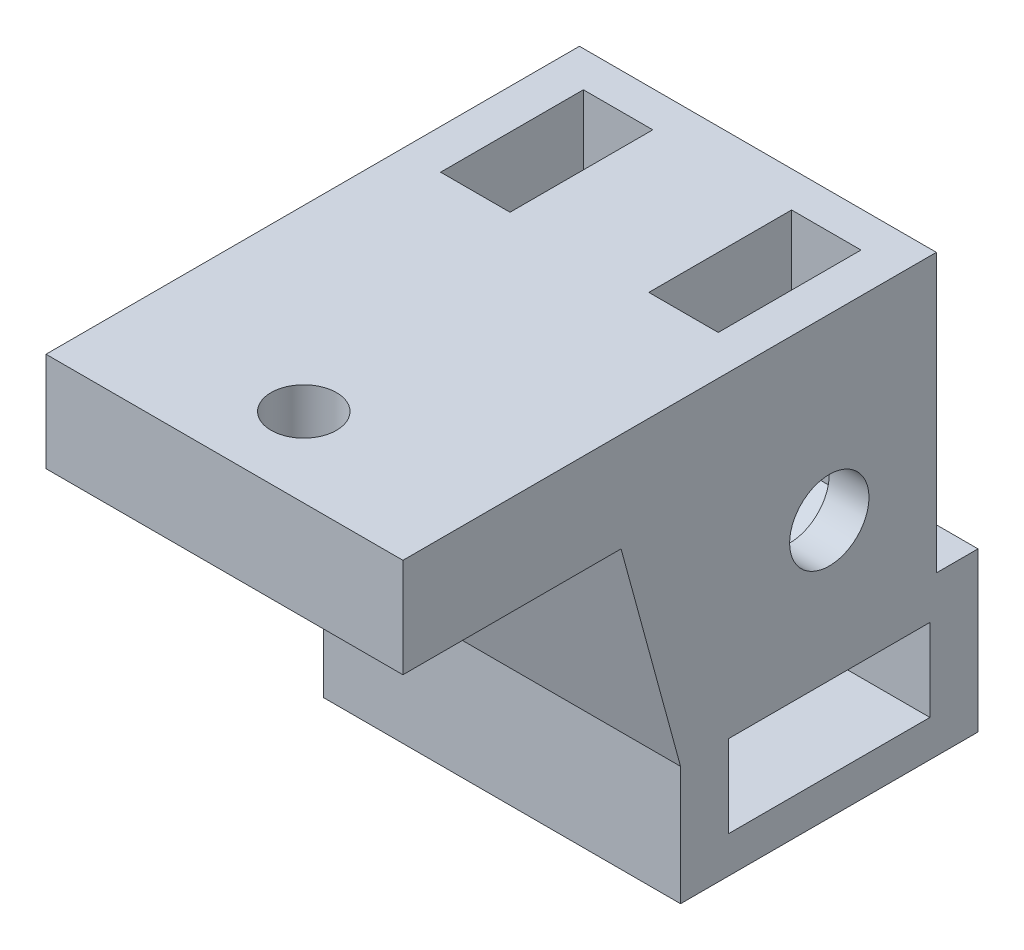
ISO-10303-21;
HEADER;
FILE_DESCRIPTION(('STEP AP214'),'2;1');
FILE_NAME('part.step','',(''),(''),'','','');
FILE_SCHEMA(('AUTOMOTIVE_DESIGN { 1 0 10303 214 1 1 1 1 }'));
ENDSEC;
DATA;
#1=APPLICATION_CONTEXT('core data for automotive mechanical design processes');
#2=APPLICATION_PROTOCOL_DEFINITION('international standard','automotive_design',2000,#1);
#3=PRODUCT_CONTEXT('',#1,'mechanical');
#4=PRODUCT('Part','Part','',(#3));
#5=PRODUCT_RELATED_PRODUCT_CATEGORY('part','',(#4));
#6=PRODUCT_DEFINITION_FORMATION('','',#4);
#7=PRODUCT_DEFINITION_CONTEXT('part definition',#1,'design');
#8=PRODUCT_DEFINITION('design','',#6,#7);
#9=PRODUCT_DEFINITION_SHAPE('','',#8);
#10=(LENGTH_UNIT() NAMED_UNIT(*) SI_UNIT(.MILLI.,.METRE.));
#11=(NAMED_UNIT(*) PLANE_ANGLE_UNIT() SI_UNIT($,.RADIAN.));
#12=(NAMED_UNIT(*) SI_UNIT($,.STERADIAN.) SOLID_ANGLE_UNIT());
#13=UNCERTAINTY_MEASURE_WITH_UNIT(LENGTH_MEASURE(1.E-05),#10,'distance_accuracy_value','');
#14=(GEOMETRIC_REPRESENTATION_CONTEXT(3) GLOBAL_UNCERTAINTY_ASSIGNED_CONTEXT((#13)) GLOBAL_UNIT_ASSIGNED_CONTEXT((#10,
#11,#12)) REPRESENTATION_CONTEXT('',''));
#15=CARTESIAN_POINT('',(0.,0.,0.));
#16=DIRECTION('',(0.,0.,1.));
#17=DIRECTION('',(1.,0.,0.));
#18=AXIS2_PLACEMENT_3D('',#15,#16,#17);
#19=CARTESIAN_POINT('',(9.,7.,0.));
#20=DIRECTION('',(-1.,0.,0.));
#21=DIRECTION('',(0.,0.,1.));
#22=AXIS2_PLACEMENT_3D('',#19,#20,#21);
#23=CYLINDRICAL_SURFACE('',#22,2.);
#24=CARTESIAN_POINT('',(3.5,7.,0.));
#25=DIRECTION('',(1.,0.,0.));
#26=DIRECTION('',(0.,0.,-1.));
#27=AXIS2_PLACEMENT_3D('',#24,#25,#26);
#28=CIRCLE('',#27,2.);
#29=CARTESIAN_POINT('',(3.5,7.,-2.));
#30=VERTEX_POINT('',#29);
#31=EDGE_CURVE('E477',#30,#30,#28,.F.);
#32=ORIENTED_EDGE('',*,*,#31,.F.);
#33=EDGE_LOOP('',(#32));
#34=FACE_BOUND('',#33,.T.);
#35=CARTESIAN_POINT('',(-3.5,7.,0.));
#36=DIRECTION('',(1.,0.,0.));
#37=DIRECTION('',(0.,0.,-1.));
#38=AXIS2_PLACEMENT_3D('',#35,#36,#37);
#39=CIRCLE('',#38,2.);
#40=CARTESIAN_POINT('',(-3.5,7.,-2.));
#41=VERTEX_POINT('',#40);
#42=EDGE_CURVE('E465',#41,#41,#39,.F.);
#43=ORIENTED_EDGE('',*,*,#42,.T.);
#44=EDGE_LOOP('',(#43));
#45=FACE_BOUND('',#44,.T.);
#46=ADVANCED_FACE('F49',(#34,#45),#23,.F.);
#47=CARTESIAN_POINT('',(9.,7.,0.));
#48=DIRECTION('',(-1.,0.,0.));
#49=DIRECTION('',(0.,0.,1.));
#50=AXIS2_PLACEMENT_3D('',#47,#48,#49);
#51=CIRCLE('',#50,2.);
#52=CARTESIAN_POINT('',(9.,7.,2.));
#53=VERTEX_POINT('',#52);
#54=EDGE_CURVE('E440',#53,#53,#51,.T.);
#55=ORIENTED_EDGE('',*,*,#54,.F.);
#56=EDGE_LOOP('',(#55));
#57=FACE_BOUND('',#56,.T.);
#58=CARTESIAN_POINT('',(7.,7.,0.));
#59=DIRECTION('',(1.,0.,0.));
#60=DIRECTION('',(0.,0.,-1.));
#61=AXIS2_PLACEMENT_3D('',#58,#59,#60);
#62=CIRCLE('',#61,2.);
#63=CARTESIAN_POINT('',(7.,7.,-2.));
#64=VERTEX_POINT('',#63);
#65=EDGE_CURVE('E473',#64,#64,#62,.F.);
#66=ORIENTED_EDGE('',*,*,#65,.T.);
#67=EDGE_LOOP('',(#66));
#68=FACE_BOUND('',#67,.T.);
#69=ADVANCED_FACE('F538',(#57,#68),#23,.F.);
#70=CARTESIAN_POINT('',(0.,16.,0.));
#71=DIRECTION('',(0.,1.,0.));
#72=DIRECTION('',(0.,0.,1.));
#73=AXIS2_PLACEMENT_3D('',#70,#71,#72);
#74=PLANE('',#73);
#75=DIRECTION('',(-1.,0.,0.));
#76=VECTOR('',#75,1.);
#77=CARTESIAN_POINT('',(9.,16.,-5.4));
#78=LINE('',#77,#76);
#79=CARTESIAN_POINT('',(9.,16.,-5.4));
#80=VERTEX_POINT('',#79);
#81=CARTESIAN_POINT('',(-9.,16.,-5.4));
#82=VERTEX_POINT('',#81);
#83=EDGE_CURVE('E263',#80,#82,#78,.T.);
#84=ORIENTED_EDGE('',*,*,#83,.T.);
#85=DIRECTION('',(0.,0.,-1.));
#86=VECTOR('',#85,1.);
#87=CARTESIAN_POINT('',(-9.,16.,0.));
#88=LINE('',#87,#86);
#89=CARTESIAN_POINT('',(-9.,16.,21.5));
#90=VERTEX_POINT('',#89);
#91=EDGE_CURVE('E452',#90,#82,#88,.T.);
#92=ORIENTED_EDGE('',*,*,#91,.F.);
#93=DIRECTION('',(1.,0.,0.));
#94=VECTOR('',#93,1.);
#95=CARTESIAN_POINT('',(-9.,16.,21.5));
#96=LINE('',#95,#94);
#97=CARTESIAN_POINT('',(9.,16.,21.5));
#98=VERTEX_POINT('',#97);
#99=EDGE_CURVE('E317',#90,#98,#96,.T.);
#100=ORIENTED_EDGE('',*,*,#99,.T.);
#101=DIRECTION('',(0.,0.,-1.));
#102=VECTOR('',#101,1.);
#103=CARTESIAN_POINT('',(9.,16.,0.));
#104=LINE('',#103,#102);
#105=EDGE_CURVE('E448',#98,#80,#104,.T.);
#106=ORIENTED_EDGE('',*,*,#105,.T.);
#107=EDGE_LOOP('',(#84,#92,#100,#106));
#108=FACE_BOUND('',#107,.T.);
#109=CARTESIAN_POINT('',(0.,16.,17.5));
#110=DIRECTION('',(0.,1.,0.));
#111=DIRECTION('',(0.,0.,1.));
#112=AXIS2_PLACEMENT_3D('',#109,#110,#111);
#113=CIRCLE('',#112,1.65);
#114=CARTESIAN_POINT('',(0.,16.,19.15));
#115=VERTEX_POINT('',#114);
#116=EDGE_CURVE('E300',#115,#115,#113,.T.);
#117=ORIENTED_EDGE('',*,*,#116,.F.);
#118=EDGE_LOOP('',(#117));
#119=FACE_BOUND('',#118,.T.);
#120=DIRECTION('',(1.,0.,0.));
#121=VECTOR('',#120,1.);
#122=CARTESIAN_POINT('',(0.,16.,3.6));
#123=LINE('',#122,#121);
#124=CARTESIAN_POINT('',(3.5,16.,3.6));
#125=VERTEX_POINT('',#124);
#126=CARTESIAN_POINT('',(7.,16.,3.6));
#127=VERTEX_POINT('',#126);
#128=EDGE_CURVE('E384',#125,#127,#123,.T.);
#129=ORIENTED_EDGE('',*,*,#128,.F.);
#130=DIRECTION('',(0.,0.,-1.));
#131=VECTOR('',#130,1.);
#132=CARTESIAN_POINT('',(3.5,16.,0.));
#133=LINE('',#132,#131);
#134=CARTESIAN_POINT('',(3.5,16.,-3.6));
#135=VERTEX_POINT('',#134);
#136=EDGE_CURVE('E397',#125,#135,#133,.T.);
#137=ORIENTED_EDGE('',*,*,#136,.T.);
#138=DIRECTION('',(1.,0.,0.));
#139=VECTOR('',#138,1.);
#140=CARTESIAN_POINT('',(0.,16.,-3.6));
#141=LINE('',#140,#139);
#142=CARTESIAN_POINT('',(7.,16.,-3.6));
#143=VERTEX_POINT('',#142);
#144=EDGE_CURVE('E393',#135,#143,#141,.T.);
#145=ORIENTED_EDGE('',*,*,#144,.T.);
#146=DIRECTION('',(0.,0.,-1.));
#147=VECTOR('',#146,1.);
#148=CARTESIAN_POINT('',(7.,16.,0.));
#149=LINE('',#148,#147);
#150=EDGE_CURVE('E388',#127,#143,#149,.T.);
#151=ORIENTED_EDGE('',*,*,#150,.F.);
#152=EDGE_LOOP('',(#129,#137,#145,#151));
#153=FACE_BOUND('',#152,.T.);
#154=DIRECTION('',(0.,0.,-1.));
#155=VECTOR('',#154,1.);
#156=CARTESIAN_POINT('',(-3.5,16.,0.));
#157=LINE('',#156,#155);
#158=CARTESIAN_POINT('',(-3.5,16.,3.6));
#159=VERTEX_POINT('',#158);
#160=CARTESIAN_POINT('',(-3.5,16.,-3.6));
#161=VERTEX_POINT('',#160);
#162=EDGE_CURVE('E417',#159,#161,#157,.T.);
#163=ORIENTED_EDGE('',*,*,#162,.F.);
#164=DIRECTION('',(-1.,0.,0.));
#165=VECTOR('',#164,1.);
#166=CARTESIAN_POINT('',(0.,16.,3.6));
#167=LINE('',#166,#165);
#168=CARTESIAN_POINT('',(-7.,16.,3.6));
#169=VERTEX_POINT('',#168);
#170=EDGE_CURVE('E377',#159,#169,#167,.T.);
#171=ORIENTED_EDGE('',*,*,#170,.T.);
#172=DIRECTION('',(0.,0.,-1.));
#173=VECTOR('',#172,1.);
#174=CARTESIAN_POINT('',(-7.,16.,0.));
#175=LINE('',#174,#173);
#176=CARTESIAN_POINT('',(-7.,16.,-3.6));
#177=VERTEX_POINT('',#176);
#178=EDGE_CURVE('E425',#169,#177,#175,.T.);
#179=ORIENTED_EDGE('',*,*,#178,.T.);
#180=DIRECTION('',(-1.,0.,0.));
#181=VECTOR('',#180,1.);
#182=CARTESIAN_POINT('',(0.,16.,-3.6));
#183=LINE('',#182,#181);
#184=EDGE_CURVE('E421',#161,#177,#183,.T.);
#185=ORIENTED_EDGE('',*,*,#184,.F.);
#186=EDGE_LOOP('',(#163,#171,#179,#185));
#187=FACE_BOUND('',#186,.T.);
#188=ADVANCED_FACE('F511',(#108,#119,#153,#187),#74,.T.);
#189=CARTESIAN_POINT('',(-7.,7.,0.));
#190=DIRECTION('',(1.,0.,0.));
#191=DIRECTION('',(0.,0.,-1.));
#192=AXIS2_PLACEMENT_3D('',#189,#190,#191);
#193=CIRCLE('',#192,2.);
#194=CARTESIAN_POINT('',(-7.,7.,-2.));
#195=VERTEX_POINT('',#194);
#196=EDGE_CURVE('E469',#195,#195,#193,.F.);
#197=ORIENTED_EDGE('',*,*,#196,.F.);
#198=EDGE_LOOP('',(#197));
#199=FACE_BOUND('',#198,.T.);
#200=CARTESIAN_POINT('',(-9.,7.,0.));
#201=DIRECTION('',(-1.,0.,0.));
#202=DIRECTION('',(0.,0.,1.));
#203=AXIS2_PLACEMENT_3D('',#200,#201,#202);
#204=CIRCLE('',#203,2.);
#205=CARTESIAN_POINT('',(-9.,7.,2.));
#206=VERTEX_POINT('',#205);
#207=EDGE_CURVE('E405',#206,#206,#204,.T.);
#208=ORIENTED_EDGE('',*,*,#207,.T.);
#209=EDGE_LOOP('',(#208));
#210=FACE_BOUND('',#209,.T.);
#211=ADVANCED_FACE('F541',(#199,#210),#23,.F.);
#212=CARTESIAN_POINT('',(9.,16.,0.));
#213=DIRECTION('',(-1.,0.,0.));
#214=DIRECTION('',(0.,0.,1.));
#215=AXIS2_PLACEMENT_3D('',#212,#213,#214);
#216=PLANE('',#215);
#217=DIRECTION('',(0.,0.,-1.));
#218=VECTOR('',#217,1.);
#219=CARTESIAN_POINT('',(9.,0.,-5.075));
#220=LINE('',#219,#218);
#221=CARTESIAN_POINT('',(9.,0.,5.075));
#222=VERTEX_POINT('',#221);
#223=CARTESIAN_POINT('',(9.,0.,-5.075));
#224=VERTEX_POINT('',#223);
#225=EDGE_CURVE('E215',#222,#224,#220,.T.);
#226=ORIENTED_EDGE('',*,*,#225,.T.);
#227=DIRECTION('',(0.,-1.,0.));
#228=VECTOR('',#227,1.);
#229=CARTESIAN_POINT('',(9.,-4.15,-5.075));
#230=LINE('',#229,#228);
#231=CARTESIAN_POINT('',(9.,-4.15,-5.075));
#232=VERTEX_POINT('',#231);
#233=EDGE_CURVE('E208',#224,#232,#230,.T.);
#234=ORIENTED_EDGE('',*,*,#233,.T.);
#235=DIRECTION('',(0.,0.,1.));
#236=VECTOR('',#235,1.);
#237=CARTESIAN_POINT('',(9.,-4.15,-5.075));
#238=LINE('',#237,#236);
#239=CARTESIAN_POINT('',(9.,-4.15,5.075));
#240=VERTEX_POINT('',#239);
#241=EDGE_CURVE('E218',#232,#240,#238,.T.);
#242=ORIENTED_EDGE('',*,*,#241,.T.);
#243=DIRECTION('',(0.,1.,0.));
#244=VECTOR('',#243,1.);
#245=CARTESIAN_POINT('',(9.,-4.15,5.075));
#246=LINE('',#245,#244);
#247=EDGE_CURVE('E66',#240,#222,#246,.T.);
#248=ORIENTED_EDGE('',*,*,#247,.T.);
#249=EDGE_LOOP('',(#226,#234,#242,#248));
#250=FACE_BOUND('',#249,.T.);
#251=ORIENTED_EDGE('',*,*,#54,.T.);
#252=EDGE_LOOP('',(#251));
#253=FACE_BOUND('',#252,.T.);
#254=DIRECTION('',(0.,0.,1.));
#255=VECTOR('',#254,1.);
#256=CARTESIAN_POINT('',(9.,2.,-7.5));
#257=LINE('',#256,#255);
#258=CARTESIAN_POINT('',(9.,2.,-7.5));
#259=VERTEX_POINT('',#258);
#260=CARTESIAN_POINT('',(9.,2.,-5.4));
#261=VERTEX_POINT('',#260);
#262=EDGE_CURVE('E270',#259,#261,#257,.T.);
#263=ORIENTED_EDGE('',*,*,#262,.T.);
#264=DIRECTION('',(0.,1.,0.));
#265=VECTOR('',#264,1.);
#266=CARTESIAN_POINT('',(9.,16.,-5.4));
#267=LINE('',#266,#265);
#268=EDGE_CURVE('E259',#261,#80,#267,.T.);
#269=ORIENTED_EDGE('',*,*,#268,.T.);
#270=ORIENTED_EDGE('',*,*,#105,.F.);
#271=DIRECTION('',(0.,-1.,0.));
#272=VECTOR('',#271,1.);
#273=CARTESIAN_POINT('',(9.,16.,21.5));
#274=LINE('',#273,#272);
#275=CARTESIAN_POINT('',(9.,11.,21.5));
#276=VERTEX_POINT('',#275);
#277=EDGE_CURVE('E305',#98,#276,#274,.T.);
#278=ORIENTED_EDGE('',*,*,#277,.T.);
#279=DIRECTION('',(0.,0.,-1.));
#280=VECTOR('',#279,1.);
#281=CARTESIAN_POINT('',(9.,11.,21.5));
#282=LINE('',#281,#280);
#283=CARTESIAN_POINT('',(9.,11.,10.5));
#284=VERTEX_POINT('',#283);
#285=EDGE_CURVE('E321',#276,#284,#282,.T.);
#286=ORIENTED_EDGE('',*,*,#285,.T.);
#287=DIRECTION('',(0.,-0.964763821237732,-0.263117405792112));
#288=VECTOR('',#287,1.);
#289=CARTESIAN_POINT('',(9.,12.9884615384615,11.0423076923077));
#290=LINE('',#289,#288);
#291=CARTESIAN_POINT('',(9.,0.,7.5));
#292=VERTEX_POINT('',#291);
#293=EDGE_CURVE('E11',#284,#292,#290,.T.);
#294=ORIENTED_EDGE('',*,*,#293,.T.);
#295=DIRECTION('',(0.,1.,0.));
#296=VECTOR('',#295,1.);
#297=CARTESIAN_POINT('',(9.,-6.,7.5));
#298=LINE('',#297,#296);
#299=CARTESIAN_POINT('',(9.,-6.,7.5));
#300=VERTEX_POINT('',#299);
#301=EDGE_CURVE('E297',#300,#292,#298,.T.);
#302=ORIENTED_EDGE('',*,*,#301,.F.);
#303=DIRECTION('',(0.,0.,1.));
#304=VECTOR('',#303,1.);
#305=CARTESIAN_POINT('',(9.,-6.,7.5));
#306=LINE('',#305,#304);
#307=CARTESIAN_POINT('',(9.,-6.,-7.5));
#308=VERTEX_POINT('',#307);
#309=EDGE_CURVE('E287',#308,#300,#306,.T.);
#310=ORIENTED_EDGE('',*,*,#309,.F.);
#311=DIRECTION('',(0.,-1.,0.));
#312=VECTOR('',#311,1.);
#313=CARTESIAN_POINT('',(9.,16.,-7.5));
#314=LINE('',#313,#312);
#315=EDGE_CURVE('E462',#259,#308,#314,.T.);
#316=ORIENTED_EDGE('',*,*,#315,.F.);
#317=EDGE_LOOP('',(#263,#269,#270,#278,#286,#294,#302,#310,#316));
#318=FACE_BOUND('',#317,.T.);
#319=ADVANCED_FACE('F223',(#250,#253,#318),#216,.F.);
#320=CARTESIAN_POINT('',(0.,16.,-7.5));
#321=DIRECTION('',(0.,0.,-1.));
#322=DIRECTION('',(-1.,0.,0.));
#323=AXIS2_PLACEMENT_3D('',#320,#321,#322);
#324=PLANE('',#323);
#325=DIRECTION('',(-1.,0.,0.));
#326=VECTOR('',#325,1.);
#327=CARTESIAN_POINT('',(9.,2.,-7.5));
#328=LINE('',#327,#326);
#329=CARTESIAN_POINT('',(-9.,2.,-7.5));
#330=VERTEX_POINT('',#329);
#331=EDGE_CURVE('E256',#259,#330,#328,.T.);
#332=ORIENTED_EDGE('',*,*,#331,.F.);
#333=ORIENTED_EDGE('',*,*,#315,.T.);
#334=DIRECTION('',(1.,0.,0.));
#335=VECTOR('',#334,1.);
#336=CARTESIAN_POINT('',(-9.,-6.,-7.5));
#337=LINE('',#336,#335);
#338=CARTESIAN_POINT('',(-9.,-6.,-7.5));
#339=VERTEX_POINT('',#338);
#340=EDGE_CURVE('E283',#339,#308,#337,.T.);
#341=ORIENTED_EDGE('',*,*,#340,.F.);
#342=DIRECTION('',(0.,-1.,0.));
#343=VECTOR('',#342,1.);
#344=CARTESIAN_POINT('',(-9.,16.,-7.5));
#345=LINE('',#344,#343);
#346=EDGE_CURVE('E456',#330,#339,#345,.T.);
#347=ORIENTED_EDGE('',*,*,#346,.F.);
#348=EDGE_LOOP('',(#332,#333,#341,#347));
#349=FACE_BOUND('',#348,.T.);
#350=ADVANCED_FACE('F522',(#349),#324,.T.);
#351=CARTESIAN_POINT('',(-9.,16.,0.));
#352=DIRECTION('',(-1.,0.,0.));
#353=DIRECTION('',(0.,0.,1.));
#354=AXIS2_PLACEMENT_3D('',#351,#352,#353);
#355=PLANE('',#354);
#356=DIRECTION('',(0.,-1.,0.));
#357=VECTOR('',#356,1.);
#358=CARTESIAN_POINT('',(-9.,-4.15,-5.075));
#359=LINE('',#358,#357);
#360=CARTESIAN_POINT('',(-9.,0.,-5.075));
#361=VERTEX_POINT('',#360);
#362=CARTESIAN_POINT('',(-9.,-4.15,-5.075));
#363=VERTEX_POINT('',#362);
#364=EDGE_CURVE('E74',#361,#363,#359,.T.);
#365=ORIENTED_EDGE('',*,*,#364,.F.);
#366=DIRECTION('',(0.,0.,-1.));
#367=VECTOR('',#366,1.);
#368=CARTESIAN_POINT('',(-9.,0.,-5.075));
#369=LINE('',#368,#367);
#370=CARTESIAN_POINT('',(-9.,0.,5.075));
#371=VERTEX_POINT('',#370);
#372=EDGE_CURVE('E227',#371,#361,#369,.T.);
#373=ORIENTED_EDGE('',*,*,#372,.F.);
#374=DIRECTION('',(0.,1.,0.));
#375=VECTOR('',#374,1.);
#376=CARTESIAN_POINT('',(-9.,-4.15,5.075));
#377=LINE('',#376,#375);
#378=CARTESIAN_POINT('',(-9.,-4.15,5.075));
#379=VERTEX_POINT('',#378);
#380=EDGE_CURVE('E231',#379,#371,#377,.T.);
#381=ORIENTED_EDGE('',*,*,#380,.F.);
#382=DIRECTION('',(0.,0.,1.));
#383=VECTOR('',#382,1.);
#384=CARTESIAN_POINT('',(-9.,-4.15,-5.075));
#385=LINE('',#384,#383);
#386=EDGE_CURVE('E240',#363,#379,#385,.T.);
#387=ORIENTED_EDGE('',*,*,#386,.F.);
#388=EDGE_LOOP('',(#365,#373,#381,#387));
#389=FACE_BOUND('',#388,.T.);
#390=DIRECTION('',(0.,1.,0.));
#391=VECTOR('',#390,1.);
#392=CARTESIAN_POINT('',(-9.,16.,-5.4));
#393=LINE('',#392,#391);
#394=CARTESIAN_POINT('',(-9.,2.,-5.4));
#395=VERTEX_POINT('',#394);
#396=EDGE_CURVE('E267',#395,#82,#393,.T.);
#397=ORIENTED_EDGE('',*,*,#396,.F.);
#398=DIRECTION('',(0.,0.,1.));
#399=VECTOR('',#398,1.);
#400=CARTESIAN_POINT('',(-9.,2.,-7.5));
#401=LINE('',#400,#399);
#402=EDGE_CURVE('E241',#330,#395,#401,.T.);
#403=ORIENTED_EDGE('',*,*,#402,.F.);
#404=ORIENTED_EDGE('',*,*,#346,.T.);
#405=DIRECTION('',(0.,0.,-1.));
#406=VECTOR('',#405,1.);
#407=CARTESIAN_POINT('',(-9.,-6.,7.5));
#408=LINE('',#407,#406);
#409=CARTESIAN_POINT('',(-9.,-6.,7.5));
#410=VERTEX_POINT('',#409);
#411=EDGE_CURVE('E250',#410,#339,#408,.T.);
#412=ORIENTED_EDGE('',*,*,#411,.F.);
#413=DIRECTION('',(0.,1.,0.));
#414=VECTOR('',#413,1.);
#415=CARTESIAN_POINT('',(-9.,-6.,7.5));
#416=LINE('',#415,#414);
#417=CARTESIAN_POINT('',(-9.,0.,7.5));
#418=VERTEX_POINT('',#417);
#419=EDGE_CURVE('E293',#410,#418,#416,.T.);
#420=ORIENTED_EDGE('',*,*,#419,.T.);
#421=DIRECTION('',(0.,0.964763821237732,0.263117405792112));
#422=VECTOR('',#421,1.);
#423=CARTESIAN_POINT('',(-9.,1.31959080414882E-13,7.5));
#424=LINE('',#423,#422);
#425=CARTESIAN_POINT('',(-9.,11.,10.5));
#426=VERTEX_POINT('',#425);
#427=EDGE_CURVE('E59',#418,#426,#424,.T.);
#428=ORIENTED_EDGE('',*,*,#427,.T.);
#429=DIRECTION('',(0.,0.,-1.));
#430=VECTOR('',#429,1.);
#431=CARTESIAN_POINT('',(-9.,11.,21.5));
#432=LINE('',#431,#430);
#433=CARTESIAN_POINT('',(-9.,11.,21.5));
#434=VERTEX_POINT('',#433);
#435=EDGE_CURVE('E322',#434,#426,#432,.T.);
#436=ORIENTED_EDGE('',*,*,#435,.F.);
#437=DIRECTION('',(0.,1.,0.));
#438=VECTOR('',#437,1.);
#439=CARTESIAN_POINT('',(-9.,16.,21.5));
#440=LINE('',#439,#438);
#441=EDGE_CURVE('E313',#434,#90,#440,.T.);
#442=ORIENTED_EDGE('',*,*,#441,.T.);
#443=ORIENTED_EDGE('',*,*,#91,.T.);
#444=EDGE_LOOP('',(#397,#403,#404,#412,#420,#428,#436,#442,#443));
#445=FACE_BOUND('',#444,.T.);
#446=ORIENTED_EDGE('',*,*,#207,.F.);
#447=EDGE_LOOP('',(#446));
#448=FACE_BOUND('',#447,.T.);
#449=ADVANCED_FACE('F490',(#389,#445,#448),#355,.T.);
#450=CARTESIAN_POINT('',(-7.,7.,0.));
#451=DIRECTION('',(1.,0.,0.));
#452=DIRECTION('',(0.,0.,-1.));
#453=AXIS2_PLACEMENT_3D('',#450,#451,#452);
#454=PLANE('',#453);
#455=DIRECTION('',(0.,1.,0.));
#456=VECTOR('',#455,1.);
#457=CARTESIAN_POINT('',(-7.,7.,-3.6));
#458=LINE('',#457,#456);
#459=CARTESIAN_POINT('',(-7.,4.92153903091735,-3.6));
#460=VERTEX_POINT('',#459);
#461=EDGE_CURVE('E432',#460,#177,#458,.T.);
#462=ORIENTED_EDGE('',*,*,#461,.T.);
#463=ORIENTED_EDGE('',*,*,#178,.F.);
#464=DIRECTION('',(0.,1.,0.));
#465=VECTOR('',#464,1.);
#466=CARTESIAN_POINT('',(-7.,7.,3.6));
#467=LINE('',#466,#465);
#468=CARTESIAN_POINT('',(-7.,4.92153903091735,3.6));
#469=VERTEX_POINT('',#468);
#470=EDGE_CURVE('E389',#469,#169,#467,.T.);
#471=ORIENTED_EDGE('',*,*,#470,.F.);
#472=DIRECTION('',(0.,0.5,0.866025403784438));
#473=VECTOR('',#472,1.);
#474=CARTESIAN_POINT('',(-7.,2.84307806183469,0.));
#475=LINE('',#474,#473);
#476=CARTESIAN_POINT('',(-7.,2.84307806183469,0.));
#477=VERTEX_POINT('',#476);
#478=EDGE_CURVE('E335',#477,#469,#475,.T.);
#479=ORIENTED_EDGE('',*,*,#478,.F.);
#480=DIRECTION('',(0.,-0.5,0.866025403784439));
#481=VECTOR('',#480,1.);
#482=CARTESIAN_POINT('',(-7.,4.92153903091735,-3.6));
#483=LINE('',#482,#481);
#484=EDGE_CURVE('E326',#460,#477,#483,.T.);
#485=ORIENTED_EDGE('',*,*,#484,.F.);
#486=EDGE_LOOP('',(#462,#463,#471,#479,#485));
#487=FACE_BOUND('',#486,.T.);
#488=ORIENTED_EDGE('',*,*,#196,.T.);
#489=EDGE_LOOP('',(#488));
#490=FACE_BOUND('',#489,.T.);
#491=ADVANCED_FACE('F560',(#487,#490),#454,.T.);
#492=CARTESIAN_POINT('',(-3.5,7.,0.));
#493=DIRECTION('',(1.,0.,0.));
#494=DIRECTION('',(0.,0.,-1.));
#495=AXIS2_PLACEMENT_3D('',#492,#493,#494);
#496=PLANE('',#495);
#497=ORIENTED_EDGE('',*,*,#162,.T.);
#498=DIRECTION('',(0.,1.,0.));
#499=VECTOR('',#498,1.);
#500=CARTESIAN_POINT('',(-3.5,7.,-3.6));
#501=LINE('',#500,#499);
#502=CARTESIAN_POINT('',(-3.5,4.92153903091735,-3.6));
#503=VERTEX_POINT('',#502);
#504=EDGE_CURVE('E435',#503,#161,#501,.T.);
#505=ORIENTED_EDGE('',*,*,#504,.F.);
#506=DIRECTION('',(0.,-0.5,0.866025403784439));
#507=VECTOR('',#506,1.);
#508=CARTESIAN_POINT('',(-3.5,4.92153903091735,-3.6));
#509=LINE('',#508,#507);
#510=CARTESIAN_POINT('',(-3.5,2.84307806183469,0.));
#511=VERTEX_POINT('',#510);
#512=EDGE_CURVE('E330',#503,#511,#509,.T.);
#513=ORIENTED_EDGE('',*,*,#512,.T.);
#514=DIRECTION('',(0.,0.5,0.866025403784438));
#515=VECTOR('',#514,1.);
#516=CARTESIAN_POINT('',(-3.5,2.84307806183469,0.));
#517=LINE('',#516,#515);
#518=CARTESIAN_POINT('',(-3.5,4.92153903091735,3.6));
#519=VERTEX_POINT('',#518);
#520=EDGE_CURVE('E334',#511,#519,#517,.T.);
#521=ORIENTED_EDGE('',*,*,#520,.T.);
#522=DIRECTION('',(0.,1.,0.));
#523=VECTOR('',#522,1.);
#524=CARTESIAN_POINT('',(-3.5,7.,3.6));
#525=LINE('',#524,#523);
#526=EDGE_CURVE('E429',#519,#159,#525,.T.);
#527=ORIENTED_EDGE('',*,*,#526,.T.);
#528=EDGE_LOOP('',(#497,#505,#513,#521,#527));
#529=FACE_BOUND('',#528,.T.);
#530=ORIENTED_EDGE('',*,*,#42,.F.);
#531=EDGE_LOOP('',(#530));
#532=FACE_BOUND('',#531,.T.);
#533=ADVANCED_FACE('F567',(#529,#532),#496,.F.);
#534=CARTESIAN_POINT('',(0.,7.,3.6));
#535=DIRECTION('',(0.,0.,-1.));
#536=DIRECTION('',(-1.,0.,0.));
#537=AXIS2_PLACEMENT_3D('',#534,#535,#536);
#538=PLANE('',#537);
#539=ORIENTED_EDGE('',*,*,#170,.F.);
#540=ORIENTED_EDGE('',*,*,#526,.F.);
#541=DIRECTION('',(-1.,0.,0.));
#542=VECTOR('',#541,1.);
#543=CARTESIAN_POINT('',(-3.5,4.92153903091735,3.6));
#544=LINE('',#543,#542);
#545=EDGE_CURVE('E346',#519,#469,#544,.T.);
#546=ORIENTED_EDGE('',*,*,#545,.T.);
#547=ORIENTED_EDGE('',*,*,#470,.T.);
#548=EDGE_LOOP('',(#539,#540,#546,#547));
#549=FACE_BOUND('',#548,.T.);
#550=ADVANCED_FACE('F782',(#549),#538,.T.);
#551=CARTESIAN_POINT('',(0.,7.,-3.6));
#552=DIRECTION('',(0.,0.,-1.));
#553=DIRECTION('',(-1.,0.,0.));
#554=AXIS2_PLACEMENT_3D('',#551,#552,#553);
#555=PLANE('',#554);
#556=ORIENTED_EDGE('',*,*,#184,.T.);
#557=ORIENTED_EDGE('',*,*,#461,.F.);
#558=DIRECTION('',(-1.,0.,0.));
#559=VECTOR('',#558,1.);
#560=CARTESIAN_POINT('',(-3.5,4.92153903091735,-3.6));
#561=LINE('',#560,#559);
#562=EDGE_CURVE('E339',#503,#460,#561,.T.);
#563=ORIENTED_EDGE('',*,*,#562,.F.);
#564=ORIENTED_EDGE('',*,*,#504,.T.);
#565=EDGE_LOOP('',(#556,#557,#563,#564));
#566=FACE_BOUND('',#565,.T.);
#567=ADVANCED_FACE('F773',(#566),#555,.F.);
#568=CARTESIAN_POINT('',(3.5,7.,0.));
#569=DIRECTION('',(1.,0.,0.));
#570=DIRECTION('',(0.,0.,-1.));
#571=AXIS2_PLACEMENT_3D('',#568,#569,#570);
#572=PLANE('',#571);
#573=DIRECTION('',(0.,1.,0.));
#574=VECTOR('',#573,1.);
#575=CARTESIAN_POINT('',(3.5,7.,-3.6));
#576=LINE('',#575,#574);
#577=CARTESIAN_POINT('',(3.5,4.92153903091735,-3.6));
#578=VERTEX_POINT('',#577);
#579=EDGE_CURVE('E406',#578,#135,#576,.T.);
#580=ORIENTED_EDGE('',*,*,#579,.T.);
#581=ORIENTED_EDGE('',*,*,#136,.F.);
#582=DIRECTION('',(0.,1.,0.));
#583=VECTOR('',#582,1.);
#584=CARTESIAN_POINT('',(3.5,7.,3.6));
#585=LINE('',#584,#583);
#586=CARTESIAN_POINT('',(3.5,4.92153903091735,3.6));
#587=VERTEX_POINT('',#586);
#588=EDGE_CURVE('E402',#587,#125,#585,.T.);
#589=ORIENTED_EDGE('',*,*,#588,.F.);
#590=DIRECTION('',(0.,0.5,0.866025403784439));
#591=VECTOR('',#590,1.);
#592=CARTESIAN_POINT('',(3.5,2.84307806183469,0.));
#593=LINE('',#592,#591);
#594=CARTESIAN_POINT('',(3.5,2.84307806183469,0.));
#595=VERTEX_POINT('',#594);
#596=EDGE_CURVE('E362',#595,#587,#593,.T.);
#597=ORIENTED_EDGE('',*,*,#596,.F.);
#598=DIRECTION('',(0.,-0.5,0.866025403784438));
#599=VECTOR('',#598,1.);
#600=CARTESIAN_POINT('',(3.5,4.92153903091735,-3.6));
#601=LINE('',#600,#599);
#602=EDGE_CURVE('E350',#578,#595,#601,.T.);
#603=ORIENTED_EDGE('',*,*,#602,.F.);
#604=EDGE_LOOP('',(#580,#581,#589,#597,#603));
#605=FACE_BOUND('',#604,.T.);
#606=ORIENTED_EDGE('',*,*,#31,.T.);
#607=EDGE_LOOP('',(#606));
#608=FACE_BOUND('',#607,.T.);
#609=ADVANCED_FACE('F763',(#605,#608),#572,.T.);
#610=CARTESIAN_POINT('',(7.,7.,0.));
#611=DIRECTION('',(1.,0.,0.));
#612=DIRECTION('',(0.,0.,-1.));
#613=AXIS2_PLACEMENT_3D('',#610,#611,#612);
#614=PLANE('',#613);
#615=ORIENTED_EDGE('',*,*,#150,.T.);
#616=DIRECTION('',(0.,1.,0.));
#617=VECTOR('',#616,1.);
#618=CARTESIAN_POINT('',(7.,7.,-3.6));
#619=LINE('',#618,#617);
#620=CARTESIAN_POINT('',(7.,4.92153903091735,-3.6));
#621=VERTEX_POINT('',#620);
#622=EDGE_CURVE('E409',#621,#143,#619,.T.);
#623=ORIENTED_EDGE('',*,*,#622,.F.);
#624=DIRECTION('',(0.,-0.5,0.866025403784438));
#625=VECTOR('',#624,1.);
#626=CARTESIAN_POINT('',(7.,4.92153903091735,-3.6));
#627=LINE('',#626,#625);
#628=CARTESIAN_POINT('',(7.,2.84307806183469,0.));
#629=VERTEX_POINT('',#628);
#630=EDGE_CURVE('E357',#621,#629,#627,.T.);
#631=ORIENTED_EDGE('',*,*,#630,.T.);
#632=DIRECTION('',(0.,0.5,0.866025403784439));
#633=VECTOR('',#632,1.);
#634=CARTESIAN_POINT('',(7.,2.84307806183469,0.));
#635=LINE('',#634,#633);
#636=CARTESIAN_POINT('',(7.,4.92153903091735,3.6));
#637=VERTEX_POINT('',#636);
#638=EDGE_CURVE('E361',#629,#637,#635,.T.);
#639=ORIENTED_EDGE('',*,*,#638,.T.);
#640=DIRECTION('',(0.,1.,0.));
#641=VECTOR('',#640,1.);
#642=CARTESIAN_POINT('',(7.,7.,3.6));
#643=LINE('',#642,#641);
#644=EDGE_CURVE('E401',#637,#127,#643,.T.);
#645=ORIENTED_EDGE('',*,*,#644,.T.);
#646=EDGE_LOOP('',(#615,#623,#631,#639,#645));
#647=FACE_BOUND('',#646,.T.);
#648=ORIENTED_EDGE('',*,*,#65,.F.);
#649=EDGE_LOOP('',(#648));
#650=FACE_BOUND('',#649,.T.);
#651=ADVANCED_FACE('F753',(#647,#650),#614,.F.);
#652=CARTESIAN_POINT('',(0.,7.,3.6));
#653=DIRECTION('',(0.,0.,1.));
#654=DIRECTION('',(1.,0.,0.));
#655=AXIS2_PLACEMENT_3D('',#652,#653,#654);
#656=PLANE('',#655);
#657=ORIENTED_EDGE('',*,*,#128,.T.);
#658=ORIENTED_EDGE('',*,*,#644,.F.);
#659=DIRECTION('',(-1.,0.,0.));
#660=VECTOR('',#659,1.);
#661=CARTESIAN_POINT('',(7.,4.92153903091735,3.6));
#662=LINE('',#661,#660);
#663=EDGE_CURVE('E373',#637,#587,#662,.T.);
#664=ORIENTED_EDGE('',*,*,#663,.T.);
#665=ORIENTED_EDGE('',*,*,#588,.T.);
#666=EDGE_LOOP('',(#657,#658,#664,#665));
#667=FACE_BOUND('',#666,.T.);
#668=ADVANCED_FACE('F744',(#667),#656,.F.);
#669=CARTESIAN_POINT('',(0.,7.,-3.6));
#670=DIRECTION('',(0.,0.,1.));
#671=DIRECTION('',(1.,0.,0.));
#672=AXIS2_PLACEMENT_3D('',#669,#670,#671);
#673=PLANE('',#672);
#674=ORIENTED_EDGE('',*,*,#144,.F.);
#675=ORIENTED_EDGE('',*,*,#579,.F.);
#676=DIRECTION('',(-1.,0.,0.));
#677=VECTOR('',#676,1.);
#678=CARTESIAN_POINT('',(7.,4.92153903091735,-3.6));
#679=LINE('',#678,#677);
#680=EDGE_CURVE('E366',#621,#578,#679,.T.);
#681=ORIENTED_EDGE('',*,*,#680,.F.);
#682=ORIENTED_EDGE('',*,*,#622,.T.);
#683=EDGE_LOOP('',(#674,#675,#681,#682));
#684=FACE_BOUND('',#683,.T.);
#685=ADVANCED_FACE('F726',(#684),#673,.T.);
#686=CARTESIAN_POINT('',(7.,2.84307806183469,0.));
#687=DIRECTION('',(0.,-0.866025403784439,0.5));
#688=DIRECTION('',(0.,-0.5,-0.866025403784439));
#689=AXIS2_PLACEMENT_3D('',#686,#687,#688);
#690=PLANE('',#689);
#691=ORIENTED_EDGE('',*,*,#596,.T.);
#692=ORIENTED_EDGE('',*,*,#663,.F.);
#693=ORIENTED_EDGE('',*,*,#638,.F.);
#694=DIRECTION('',(-1.,0.,0.));
#695=VECTOR('',#694,1.);
#696=CARTESIAN_POINT('',(7.,2.84307806183469,0.));
#697=LINE('',#696,#695);
#698=EDGE_CURVE('E378',#629,#595,#697,.T.);
#699=ORIENTED_EDGE('',*,*,#698,.T.);
#700=EDGE_LOOP('',(#691,#692,#693,#699));
#701=FACE_BOUND('',#700,.T.);
#702=ADVANCED_FACE('F716',(#701),#690,.F.);
#703=CARTESIAN_POINT('',(7.,4.92153903091735,-3.6));
#704=DIRECTION('',(0.,-0.866025403784438,-0.5));
#705=DIRECTION('',(0.,0.5,-0.866025403784439));
#706=AXIS2_PLACEMENT_3D('',#703,#704,#705);
#707=PLANE('',#706);
#708=ORIENTED_EDGE('',*,*,#602,.T.);
#709=ORIENTED_EDGE('',*,*,#698,.F.);
#710=ORIENTED_EDGE('',*,*,#630,.F.);
#711=ORIENTED_EDGE('',*,*,#680,.T.);
#712=EDGE_LOOP('',(#708,#709,#710,#711));
#713=FACE_BOUND('',#712,.T.);
#714=ADVANCED_FACE('F699',(#713),#707,.F.);
#715=CARTESIAN_POINT('',(-3.5,2.84307806183469,0.));
#716=DIRECTION('',(0.,-0.866025403784438,0.5));
#717=DIRECTION('',(0.,-0.5,-0.866025403784439));
#718=AXIS2_PLACEMENT_3D('',#715,#716,#717);
#719=PLANE('',#718);
#720=ORIENTED_EDGE('',*,*,#478,.T.);
#721=ORIENTED_EDGE('',*,*,#545,.F.);
#722=ORIENTED_EDGE('',*,*,#520,.F.);
#723=DIRECTION('',(-1.,0.,0.));
#724=VECTOR('',#723,1.);
#725=CARTESIAN_POINT('',(-3.5,2.84307806183469,0.));
#726=LINE('',#725,#724);
#727=EDGE_CURVE('E351',#511,#477,#726,.T.);
#728=ORIENTED_EDGE('',*,*,#727,.T.);
#729=EDGE_LOOP('',(#720,#721,#722,#728));
#730=FACE_BOUND('',#729,.T.);
#731=ADVANCED_FACE('F688',(#730),#719,.F.);
#732=CARTESIAN_POINT('',(-3.5,4.92153903091735,-3.6));
#733=DIRECTION('',(0.,-0.866025403784439,-0.5));
#734=DIRECTION('',(0.,0.5,-0.866025403784439));
#735=AXIS2_PLACEMENT_3D('',#732,#733,#734);
#736=PLANE('',#735);
#737=ORIENTED_EDGE('',*,*,#484,.T.);
#738=ORIENTED_EDGE('',*,*,#727,.F.);
#739=ORIENTED_EDGE('',*,*,#512,.F.);
#740=ORIENTED_EDGE('',*,*,#562,.T.);
#741=EDGE_LOOP('',(#737,#738,#739,#740));
#742=FACE_BOUND('',#741,.T.);
#743=ADVANCED_FACE('F677',(#742),#736,.F.);
#744=CARTESIAN_POINT('',(-9.,11.,21.5));
#745=DIRECTION('',(0.,-1.,0.));
#746=DIRECTION('',(1.,0.,0.));
#747=AXIS2_PLACEMENT_3D('',#744,#745,#746);
#748=PLANE('',#747);
#749=CARTESIAN_POINT('',(0.,11.,17.5));
#750=DIRECTION('',(0.,-1.,0.));
#751=DIRECTION('',(1.,0.,0.));
#752=AXIS2_PLACEMENT_3D('',#749,#750,#751);
#753=CIRCLE('',#752,1.65);
#754=CARTESIAN_POINT('',(1.65,11.,17.5));
#755=VERTEX_POINT('',#754);
#756=EDGE_CURVE('E304',#755,#755,#753,.T.);
#757=ORIENTED_EDGE('',*,*,#756,.F.);
#758=EDGE_LOOP('',(#757));
#759=FACE_BOUND('',#758,.T.);
#760=ORIENTED_EDGE('',*,*,#435,.T.);
#761=DIRECTION('',(1.,0.,0.));
#762=VECTOR('',#761,1.);
#763=CARTESIAN_POINT('',(-9.,11.,10.5));
#764=LINE('',#763,#762);
#765=EDGE_CURVE('E481',#426,#284,#764,.T.);
#766=ORIENTED_EDGE('',*,*,#765,.T.);
#767=ORIENTED_EDGE('',*,*,#285,.F.);
#768=DIRECTION('',(-1.,0.,0.));
#769=VECTOR('',#768,1.);
#770=CARTESIAN_POINT('',(-9.,11.,21.5));
#771=LINE('',#770,#769);
#772=EDGE_CURVE('E309',#276,#434,#771,.T.);
#773=ORIENTED_EDGE('',*,*,#772,.T.);
#774=EDGE_LOOP('',(#760,#766,#767,#773));
#775=FACE_BOUND('',#774,.T.);
#776=ADVANCED_FACE('F498',(#759,#775),#748,.T.);
#777=CARTESIAN_POINT('',(0.,0.,21.5));
#778=DIRECTION('',(0.,0.,1.));
#779=DIRECTION('',(1.,0.,0.));
#780=AXIS2_PLACEMENT_3D('',#777,#778,#779);
#781=PLANE('',#780);
#782=ORIENTED_EDGE('',*,*,#277,.F.);
#783=ORIENTED_EDGE('',*,*,#99,.F.);
#784=ORIENTED_EDGE('',*,*,#441,.F.);
#785=ORIENTED_EDGE('',*,*,#772,.F.);
#786=EDGE_LOOP('',(#782,#783,#784,#785));
#787=FACE_BOUND('',#786,.T.);
#788=ADVANCED_FACE('F507',(#787),#781,.T.);
#789=CARTESIAN_POINT('',(0.,8.,17.5));
#790=DIRECTION('',(0.,1.,0.));
#791=DIRECTION('',(0.,0.,1.));
#792=AXIS2_PLACEMENT_3D('',#789,#790,#791);
#793=CYLINDRICAL_SURFACE('',#792,1.65);
#794=ORIENTED_EDGE('',*,*,#756,.T.);
#795=EDGE_LOOP('',(#794));
#796=FACE_BOUND('',#795,.T.);
#797=ORIENTED_EDGE('',*,*,#116,.T.);
#798=EDGE_LOOP('',(#797));
#799=FACE_BOUND('',#798,.T.);
#800=ADVANCED_FACE('F535',(#796,#799),#793,.F.);
#801=CARTESIAN_POINT('',(0.,1.31838984174237E-13,7.5));
#802=DIRECTION('',(0.,0.263117405792112,-0.964763821237731));
#803=DIRECTION('',(-1.,0.,0.));
#804=AXIS2_PLACEMENT_3D('',#801,#802,#803);
#805=PLANE('',#804);
#806=ORIENTED_EDGE('',*,*,#293,.F.);
#807=ORIENTED_EDGE('',*,*,#765,.F.);
#808=ORIENTED_EDGE('',*,*,#427,.F.);
#809=DIRECTION('',(1.,0.,0.));
#810=VECTOR('',#809,1.);
#811=CARTESIAN_POINT('',(0.,0.,7.5));
#812=LINE('',#811,#810);
#813=EDGE_CURVE('E444',#418,#292,#812,.T.);
#814=ORIENTED_EDGE('',*,*,#813,.T.);
#815=EDGE_LOOP('',(#806,#807,#808,#814));
#816=FACE_BOUND('',#815,.T.);
#817=ADVANCED_FACE('F52',(#816),#805,.F.);
#818=CARTESIAN_POINT('',(-9.,-6.,7.5));
#819=DIRECTION('',(0.,0.,-1.));
#820=DIRECTION('',(-1.,0.,0.));
#821=AXIS2_PLACEMENT_3D('',#818,#819,#820);
#822=PLANE('',#821);
#823=ORIENTED_EDGE('',*,*,#813,.F.);
#824=ORIENTED_EDGE('',*,*,#419,.F.);
#825=DIRECTION('',(-1.,0.,0.));
#826=VECTOR('',#825,1.);
#827=CARTESIAN_POINT('',(-9.,-6.,7.5));
#828=LINE('',#827,#826);
#829=EDGE_CURVE('E290',#300,#410,#828,.T.);
#830=ORIENTED_EDGE('',*,*,#829,.F.);
#831=ORIENTED_EDGE('',*,*,#301,.T.);
#832=EDGE_LOOP('',(#823,#824,#830,#831));
#833=FACE_BOUND('',#832,.T.);
#834=ADVANCED_FACE('F527',(#833),#822,.F.);
#835=CARTESIAN_POINT('',(0.,-6.,0.));
#836=DIRECTION('',(0.,-1.,0.));
#837=DIRECTION('',(0.,0.,-1.));
#838=AXIS2_PLACEMENT_3D('',#835,#836,#837);
#839=PLANE('',#838);
#840=ORIENTED_EDGE('',*,*,#411,.T.);
#841=ORIENTED_EDGE('',*,*,#340,.T.);
#842=ORIENTED_EDGE('',*,*,#309,.T.);
#843=ORIENTED_EDGE('',*,*,#829,.T.);
#844=EDGE_LOOP('',(#840,#841,#842,#843));
#845=FACE_BOUND('',#844,.T.);
#846=ADVANCED_FACE('F525',(#845),#839,.T.);
#847=CARTESIAN_POINT('',(9.,16.,-5.4));
#848=DIRECTION('',(0.,0.,1.));
#849=DIRECTION('',(0.,-1.,0.));
#850=AXIS2_PLACEMENT_3D('',#847,#848,#849);
#851=PLANE('',#850);
#852=ORIENTED_EDGE('',*,*,#396,.T.);
#853=ORIENTED_EDGE('',*,*,#83,.F.);
#854=ORIENTED_EDGE('',*,*,#268,.F.);
#855=DIRECTION('',(-1.,0.,0.));
#856=VECTOR('',#855,1.);
#857=CARTESIAN_POINT('',(9.,2.,-5.4));
#858=LINE('',#857,#856);
#859=EDGE_CURVE('E260',#261,#395,#858,.T.);
#860=ORIENTED_EDGE('',*,*,#859,.T.);
#861=EDGE_LOOP('',(#852,#853,#854,#860));
#862=FACE_BOUND('',#861,.T.);
#863=ADVANCED_FACE('F515',(#862),#851,.F.);
#864=CARTESIAN_POINT('',(9.,2.,-7.5));
#865=DIRECTION('',(0.,-1.,0.));
#866=DIRECTION('',(0.,0.,-1.));
#867=AXIS2_PLACEMENT_3D('',#864,#865,#866);
#868=PLANE('',#867);
#869=ORIENTED_EDGE('',*,*,#402,.T.);
#870=ORIENTED_EDGE('',*,*,#859,.F.);
#871=ORIENTED_EDGE('',*,*,#262,.F.);
#872=ORIENTED_EDGE('',*,*,#331,.T.);
#873=EDGE_LOOP('',(#869,#870,#871,#872));
#874=FACE_BOUND('',#873,.T.);
#875=ADVANCED_FACE('F519',(#874),#868,.F.);
#876=CARTESIAN_POINT('',(9.,-4.15,-5.075));
#877=DIRECTION('',(0.,0.,-1.));
#878=DIRECTION('',(-1.,0.,0.));
#879=AXIS2_PLACEMENT_3D('',#876,#877,#878);
#880=PLANE('',#879);
#881=ORIENTED_EDGE('',*,*,#364,.T.);
#882=DIRECTION('',(-1.,0.,0.));
#883=VECTOR('',#882,1.);
#884=CARTESIAN_POINT('',(9.,-4.15,-5.075));
#885=LINE('',#884,#883);
#886=EDGE_CURVE('E204',#232,#363,#885,.T.);
#887=ORIENTED_EDGE('',*,*,#886,.F.);
#888=ORIENTED_EDGE('',*,*,#233,.F.);
#889=DIRECTION('',(-1.,0.,0.));
#890=VECTOR('',#889,1.);
#891=CARTESIAN_POINT('',(9.,0.,-5.075));
#892=LINE('',#891,#890);
#893=EDGE_CURVE('E247',#224,#361,#892,.T.);
#894=ORIENTED_EDGE('',*,*,#893,.T.);
#895=EDGE_LOOP('',(#881,#887,#888,#894));
#896=FACE_BOUND('',#895,.T.);
#897=ADVANCED_FACE('F206',(#896),#880,.F.);
#898=CARTESIAN_POINT('',(9.,0.,-5.075));
#899=DIRECTION('',(0.,1.,0.));
#900=DIRECTION('',(0.,0.,1.));
#901=AXIS2_PLACEMENT_3D('',#898,#899,#900);
#902=PLANE('',#901);
#903=ORIENTED_EDGE('',*,*,#372,.T.);
#904=ORIENTED_EDGE('',*,*,#893,.F.);
#905=ORIENTED_EDGE('',*,*,#225,.F.);
#906=DIRECTION('',(-1.,0.,0.));
#907=VECTOR('',#906,1.);
#908=CARTESIAN_POINT('',(9.,0.,5.075));
#909=LINE('',#908,#907);
#910=EDGE_CURVE('E251',#222,#371,#909,.T.);
#911=ORIENTED_EDGE('',*,*,#910,.T.);
#912=EDGE_LOOP('',(#903,#904,#905,#911));
#913=FACE_BOUND('',#912,.T.);
#914=ADVANCED_FACE('F575',(#913),#902,.F.);
#915=CARTESIAN_POINT('',(9.,-4.15,5.075));
#916=DIRECTION('',(0.,0.,1.));
#917=DIRECTION('',(1.,0.,0.));
#918=AXIS2_PLACEMENT_3D('',#915,#916,#917);
#919=PLANE('',#918);
#920=ORIENTED_EDGE('',*,*,#380,.T.);
#921=ORIENTED_EDGE('',*,*,#910,.F.);
#922=ORIENTED_EDGE('',*,*,#247,.F.);
#923=DIRECTION('',(-1.,0.,0.));
#924=VECTOR('',#923,1.);
#925=CARTESIAN_POINT('',(9.,-4.15,5.075));
#926=LINE('',#925,#924);
#927=EDGE_CURVE('E214',#240,#379,#926,.T.);
#928=ORIENTED_EDGE('',*,*,#927,.T.);
#929=EDGE_LOOP('',(#920,#921,#922,#928));
#930=FACE_BOUND('',#929,.T.);
#931=ADVANCED_FACE('F573',(#930),#919,.F.);
#932=CARTESIAN_POINT('',(9.,-4.15,-5.075));
#933=DIRECTION('',(0.,-1.,0.));
#934=DIRECTION('',(0.,0.,-1.));
#935=AXIS2_PLACEMENT_3D('',#932,#933,#934);
#936=PLANE('',#935);
#937=ORIENTED_EDGE('',*,*,#386,.T.);
#938=ORIENTED_EDGE('',*,*,#927,.F.);
#939=ORIENTED_EDGE('',*,*,#241,.F.);
#940=ORIENTED_EDGE('',*,*,#886,.T.);
#941=EDGE_LOOP('',(#937,#938,#939,#940));
#942=FACE_BOUND('',#941,.T.);
#943=ADVANCED_FACE('F219',(#942),#936,.F.);
#944=CLOSED_SHELL('',(#46,#69,#188,#211,#319,#350,#449,#491,#533,#550,#567,#609,#651,#668,#685,
#702,#714,#731,#743,#776,#788,#800,#817,#834,#846,#863,#875,#897,#914,#931,#943));
#945=MANIFOLD_SOLID_BREP('B2',#944);
#946=ADVANCED_BREP_SHAPE_REPRESENTATION('',(#18,#945),#14);
#947=SHAPE_DEFINITION_REPRESENTATION(#9,#946);
ENDSEC;
END-ISO-10303-21;
